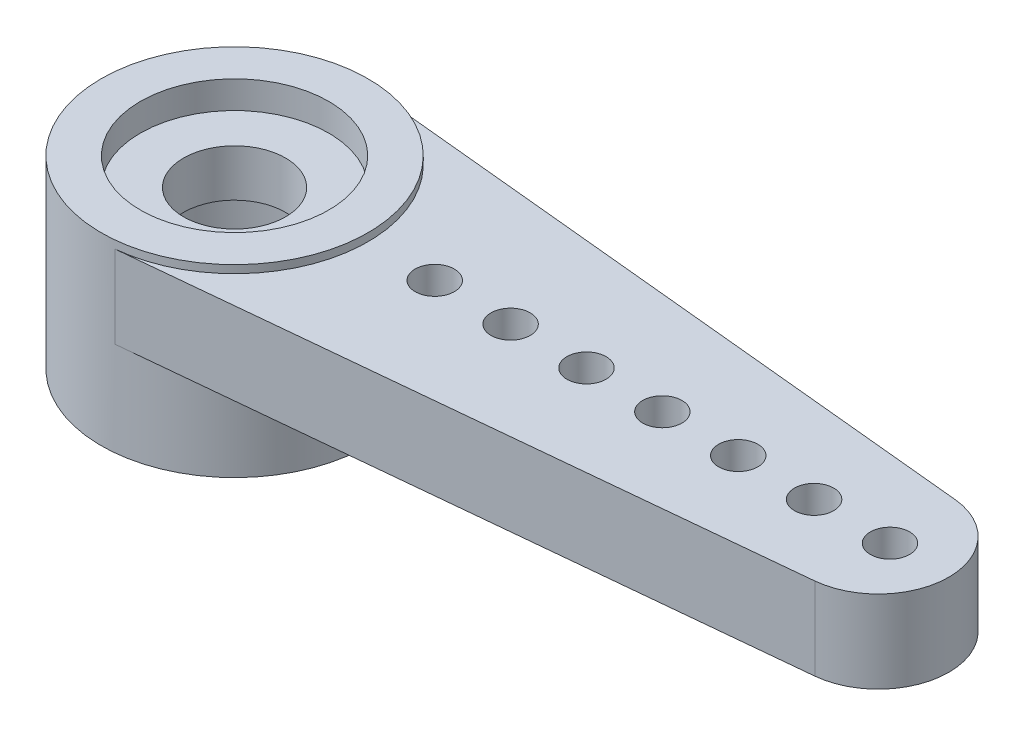
ISO-10303-21;
HEADER;
FILE_DESCRIPTION(('STEP AP214'),'2;1');
FILE_NAME('part.step','',(''),(''),'','','');
FILE_SCHEMA(('AUTOMOTIVE_DESIGN { 1 0 10303 214 1 1 1 1 }'));
ENDSEC;
DATA;
#1=APPLICATION_CONTEXT('core data for automotive mechanical design processes');
#2=APPLICATION_PROTOCOL_DEFINITION('international standard','automotive_design',2000,#1);
#3=PRODUCT_CONTEXT('',#1,'mechanical');
#4=PRODUCT('Part','Part','',(#3));
#5=PRODUCT_RELATED_PRODUCT_CATEGORY('part','',(#4));
#6=PRODUCT_DEFINITION_FORMATION('','',#4);
#7=PRODUCT_DEFINITION_CONTEXT('part definition',#1,'design');
#8=PRODUCT_DEFINITION('design','',#6,#7);
#9=PRODUCT_DEFINITION_SHAPE('','',#8);
#10=(LENGTH_UNIT() NAMED_UNIT(*) SI_UNIT(.MILLI.,.METRE.));
#11=(NAMED_UNIT(*) PLANE_ANGLE_UNIT() SI_UNIT($,.RADIAN.));
#12=(NAMED_UNIT(*) SI_UNIT($,.STERADIAN.) SOLID_ANGLE_UNIT());
#13=UNCERTAINTY_MEASURE_WITH_UNIT(LENGTH_MEASURE(1.E-05),#10,'distance_accuracy_value','');
#14=(GEOMETRIC_REPRESENTATION_CONTEXT(3) GLOBAL_UNCERTAINTY_ASSIGNED_CONTEXT((#13)) GLOBAL_UNIT_ASSIGNED_CONTEXT((#10,
#11,#12)) REPRESENTATION_CONTEXT('',''));
#15=CARTESIAN_POINT('',(0.,0.,0.));
#16=DIRECTION('',(0.,0.,1.));
#17=DIRECTION('',(1.,0.,0.));
#18=AXIS2_PLACEMENT_3D('',#15,#16,#17);
#19=CARTESIAN_POINT('',(30.,0.,0.));
#20=DIRECTION('',(0.,-1.,0.));
#21=DIRECTION('',(0.,0.,-1.));
#22=AXIS2_PLACEMENT_3D('',#19,#20,#21);
#23=PLANE('',#22);
#24=CARTESIAN_POINT('',(30.,0.,0.));
#25=DIRECTION('',(0.,1.,0.));
#26=DIRECTION('',(1.,0.,0.));
#27=AXIS2_PLACEMENT_3D('',#24,#25,#26);
#28=CIRCLE('',#27,2.4);
#29=CARTESIAN_POINT('',(27.6,0.,0.));
#30=VERTEX_POINT('',#29);
#31=EDGE_CURVE('E157',#30,#30,#28,.T.);
#32=ORIENTED_EDGE('',*,*,#31,.F.);
#33=EDGE_LOOP('',(#32));
#34=FACE_BOUND('',#33,.T.);
#35=CARTESIAN_POINT('',(30.,0.,0.));
#36=DIRECTION('',(0.,-1.,0.));
#37=DIRECTION('',(1.,0.,0.));
#38=AXIS2_PLACEMENT_3D('',#35,#36,#37);
#39=CIRCLE('',#38,3.4);
#40=CARTESIAN_POINT('',(26.6,0.,0.));
#41=VERTEX_POINT('',#40);
#42=EDGE_CURVE('E11',#41,#41,#39,.T.);
#43=ORIENTED_EDGE('',*,*,#42,.F.);
#44=EDGE_LOOP('',(#43));
#45=FACE_BOUND('',#44,.T.);
#46=ADVANCED_FACE('F17',(#34,#45),#23,.F.);
#47=CARTESIAN_POINT('',(30.,-4.7,0.));
#48=DIRECTION('',(0.,-1.,0.));
#49=DIRECTION('',(0.,0.,-1.));
#50=AXIS2_PLACEMENT_3D('',#47,#48,#49);
#51=PLANE('',#50);
#52=CARTESIAN_POINT('',(30.,-4.7,0.));
#53=DIRECTION('',(0.,1.,0.));
#54=DIRECTION('',(1.,0.,0.));
#55=AXIS2_PLACEMENT_3D('',#52,#53,#54);
#56=CIRCLE('',#55,2.4);
#57=CARTESIAN_POINT('',(27.6,-4.7,0.));
#58=VERTEX_POINT('',#57);
#59=EDGE_CURVE('E283',#58,#58,#56,.T.);
#60=ORIENTED_EDGE('',*,*,#59,.T.);
#61=EDGE_LOOP('',(#60));
#62=FACE_BOUND('',#61,.T.);
#63=CARTESIAN_POINT('',(30.,-4.7,0.));
#64=DIRECTION('',(0.,-1.,0.));
#65=DIRECTION('',(1.,0.,0.));
#66=AXIS2_PLACEMENT_3D('',#63,#64,#65);
#67=CIRCLE('',#66,3.4);
#68=CARTESIAN_POINT('',(26.6,-4.7,0.));
#69=VERTEX_POINT('',#68);
#70=EDGE_CURVE('E175',#69,#69,#67,.T.);
#71=ORIENTED_EDGE('',*,*,#70,.T.);
#72=EDGE_LOOP('',(#71));
#73=FACE_BOUND('',#72,.T.);
#74=ADVANCED_FACE('F296',(#62,#73),#51,.T.);
#75=CARTESIAN_POINT('',(30.,0.,0.));
#76=DIRECTION('',(0.,-1.,0.));
#77=DIRECTION('',(1.,0.,0.));
#78=AXIS2_PLACEMENT_3D('',#75,#76,#77);
#79=CYLINDRICAL_SURFACE('',#78,3.4);
#80=DIRECTION('',(0.,-1.,0.));
#81=VECTOR('',#80,1.);
#82=CARTESIAN_POINT('',(30.3317073170732,0.,-3.38378046802721));
#83=LINE('',#82,#81);
#84=CARTESIAN_POINT('',(30.3317073170732,-0.2,-3.38378046802721));
#85=VERTEX_POINT('',#84);
#86=CARTESIAN_POINT('',(30.3317073170732,-2.3,-3.38378046802721));
#87=VERTEX_POINT('',#86);
#88=EDGE_CURVE('E268',#85,#87,#83,.T.);
#89=ORIENTED_EDGE('',*,*,#88,.T.);
#90=CARTESIAN_POINT('',(30.,-2.3,0.));
#91=DIRECTION('',(0.,-1.,0.));
#92=DIRECTION('',(1.,0.,0.));
#93=AXIS2_PLACEMENT_3D('',#90,#91,#92);
#94=CIRCLE('',#93,3.4);
#95=CARTESIAN_POINT('',(30.3317073170732,-2.3,3.38378046802687));
#96=VERTEX_POINT('',#95);
#97=EDGE_CURVE('E264',#87,#96,#94,.T.);
#98=ORIENTED_EDGE('',*,*,#97,.T.);
#99=DIRECTION('',(0.,-1.,0.));
#100=VECTOR('',#99,1.);
#101=CARTESIAN_POINT('',(30.3317073170732,0.,3.38378046802687));
#102=LINE('',#101,#100);
#103=CARTESIAN_POINT('',(30.3317073170732,-0.2,3.38378046802687));
#104=VERTEX_POINT('',#103);
#105=EDGE_CURVE('E245',#104,#96,#102,.T.);
#106=ORIENTED_EDGE('',*,*,#105,.F.);
#107=CARTESIAN_POINT('',(30.,-0.2,0.));
#108=DIRECTION('',(0.,1.,0.));
#109=DIRECTION('',(1.,0.,0.));
#110=AXIS2_PLACEMENT_3D('',#107,#108,#109);
#111=CIRCLE('',#110,3.4);
#112=EDGE_CURVE('E267',#104,#85,#111,.T.);
#113=ORIENTED_EDGE('',*,*,#112,.T.);
#114=EDGE_LOOP('',(#89,#98,#106,#113));
#115=FACE_BOUND('',#114,.T.);
#116=ORIENTED_EDGE('',*,*,#70,.F.);
#117=DIRECTION('',(0.,1.,0.));
#118=VECTOR('',#117,1.);
#119=CARTESIAN_POINT('',(26.6,0.,0.));
#120=LINE('',#119,#118);
#121=EDGE_CURVE('E20',#69,#41,#120,.T.);
#122=ORIENTED_EDGE('',*,*,#121,.T.);
#123=ORIENTED_EDGE('',*,*,#42,.T.);
#124=ORIENTED_EDGE('',*,*,#121,.F.);
#125=EDGE_LOOP('',(#116,#122,#123,#124));
#126=FACE_BOUND('',#125,.T.);
#127=ADVANCED_FACE('F299',(#115,#126),#79,.T.);
#128=CARTESIAN_POINT('',(30.,0.,0.));
#129=DIRECTION('',(0.,-1.,0.));
#130=DIRECTION('',(1.,0.,0.));
#131=AXIS2_PLACEMENT_3D('',#128,#129,#130);
#132=CYLINDRICAL_SURFACE('',#131,2.4);
#133=ORIENTED_EDGE('',*,*,#59,.F.);
#134=DIRECTION('',(0.,1.,0.));
#135=VECTOR('',#134,1.);
#136=CARTESIAN_POINT('',(27.6,0.,0.));
#137=LINE('',#136,#135);
#138=CARTESIAN_POINT('',(27.6,-1.9,0.));
#139=VERTEX_POINT('',#138);
#140=EDGE_CURVE('E178',#58,#139,#137,.T.);
#141=ORIENTED_EDGE('',*,*,#140,.T.);
#142=CARTESIAN_POINT('',(30.,-1.9,0.));
#143=DIRECTION('',(0.,1.,0.));
#144=DIRECTION('',(1.,0.,0.));
#145=AXIS2_PLACEMENT_3D('',#142,#143,#144);
#146=CIRCLE('',#145,2.4);
#147=EDGE_CURVE('E294',#139,#139,#146,.T.);
#148=ORIENTED_EDGE('',*,*,#147,.T.);
#149=ORIENTED_EDGE('',*,*,#140,.F.);
#150=EDGE_LOOP('',(#133,#141,#148,#149));
#151=FACE_BOUND('',#150,.T.);
#152=ADVANCED_FACE('F292',(#151),#132,.F.);
#153=CARTESIAN_POINT('',(39.2658536585367,-0.2,-1.73194791841524E-13));
#154=DIRECTION('',(0.,-1.,0.));
#155=DIRECTION('',(0.,0.,-1.));
#156=AXIS2_PLACEMENT_3D('',#153,#154,#155);
#157=PLANE('',#156);
#158=CARTESIAN_POINT('',(35.1,-0.2,0.));
#159=DIRECTION('',(0.,1.,0.));
#160=DIRECTION('',(1.,0.,0.));
#161=AXIS2_PLACEMENT_3D('',#158,#159,#160);
#162=CIRCLE('',#161,0.5);
#163=CARTESIAN_POINT('',(34.6,-0.2,0.));
#164=VERTEX_POINT('',#163);
#165=EDGE_CURVE('E182',#164,#164,#162,.T.);
#166=ORIENTED_EDGE('',*,*,#165,.F.);
#167=EDGE_LOOP('',(#166));
#168=FACE_BOUND('',#167,.T.);
#169=CARTESIAN_POINT('',(44.7666666666667,-0.2,0.));
#170=DIRECTION('',(0.,1.,0.));
#171=DIRECTION('',(1.,0.,0.));
#172=AXIS2_PLACEMENT_3D('',#169,#170,#171);
#173=CIRCLE('',#172,0.5);
#174=CARTESIAN_POINT('',(44.2666666666667,-0.2,0.));
#175=VERTEX_POINT('',#174);
#176=EDGE_CURVE('E192',#175,#175,#173,.T.);
#177=ORIENTED_EDGE('',*,*,#176,.F.);
#178=EDGE_LOOP('',(#177));
#179=FACE_BOUND('',#178,.T.);
#180=CARTESIAN_POINT('',(38.9666666666667,-0.2,0.));
#181=DIRECTION('',(0.,1.,0.));
#182=DIRECTION('',(1.,0.,0.));
#183=AXIS2_PLACEMENT_3D('',#180,#181,#182);
#184=CIRCLE('',#183,0.5);
#185=CARTESIAN_POINT('',(38.4666666666667,-0.2,0.));
#186=VERTEX_POINT('',#185);
#187=EDGE_CURVE('E183',#186,#186,#184,.T.);
#188=ORIENTED_EDGE('',*,*,#187,.F.);
#189=EDGE_LOOP('',(#188));
#190=FACE_BOUND('',#189,.T.);
#191=CARTESIAN_POINT('',(46.7,-0.2,0.));
#192=DIRECTION('',(0.,1.,0.));
#193=DIRECTION('',(1.,0.,0.));
#194=AXIS2_PLACEMENT_3D('',#191,#192,#193);
#195=CIRCLE('',#194,0.5);
#196=CARTESIAN_POINT('',(46.2,-0.2,0.));
#197=VERTEX_POINT('',#196);
#198=EDGE_CURVE('E205',#197,#197,#195,.T.);
#199=ORIENTED_EDGE('',*,*,#198,.F.);
#200=EDGE_LOOP('',(#199));
#201=FACE_BOUND('',#200,.T.);
#202=CARTESIAN_POINT('',(37.0333333333333,-0.2,0.));
#203=DIRECTION('',(0.,1.,0.));
#204=DIRECTION('',(1.,0.,0.));
#205=AXIS2_PLACEMENT_3D('',#202,#203,#204);
#206=CIRCLE('',#205,0.5);
#207=CARTESIAN_POINT('',(36.5333333333333,-0.2,0.));
#208=VERTEX_POINT('',#207);
#209=EDGE_CURVE('E227',#208,#208,#206,.T.);
#210=ORIENTED_EDGE('',*,*,#209,.F.);
#211=EDGE_LOOP('',(#210));
#212=FACE_BOUND('',#211,.T.);
#213=CARTESIAN_POINT('',(42.8333333333333,-0.2,0.));
#214=DIRECTION('',(0.,1.,0.));
#215=DIRECTION('',(1.,0.,0.));
#216=AXIS2_PLACEMENT_3D('',#213,#214,#215);
#217=CIRCLE('',#216,0.5);
#218=CARTESIAN_POINT('',(42.3333333333333,-0.2,0.));
#219=VERTEX_POINT('',#218);
#220=EDGE_CURVE('E211',#219,#219,#217,.T.);
#221=ORIENTED_EDGE('',*,*,#220,.F.);
#222=EDGE_LOOP('',(#221));
#223=FACE_BOUND('',#222,.T.);
#224=CARTESIAN_POINT('',(40.9,-0.2,0.));
#225=DIRECTION('',(0.,1.,0.));
#226=DIRECTION('',(1.,0.,0.));
#227=AXIS2_PLACEMENT_3D('',#224,#225,#226);
#228=CIRCLE('',#227,0.5);
#229=CARTESIAN_POINT('',(40.4,-0.2,0.));
#230=VERTEX_POINT('',#229);
#231=EDGE_CURVE('E238',#230,#230,#228,.T.);
#232=ORIENTED_EDGE('',*,*,#231,.F.);
#233=EDGE_LOOP('',(#232));
#234=FACE_BOUND('',#233,.T.);
#235=DIRECTION('',(0.995229549419666,0.,0.0975609756097661));
#236=VECTOR('',#235,1.);
#237=CARTESIAN_POINT('',(30.3317073170732,-0.2,-3.38378046802721));
#238=LINE('',#237,#236);
#239=CARTESIAN_POINT('',(46.5756097560976,-0.2,-1.79141318895558));
#240=VERTEX_POINT('',#239);
#241=EDGE_CURVE('E272',#85,#240,#238,.T.);
#242=ORIENTED_EDGE('',*,*,#241,.F.);
#243=ORIENTED_EDGE('',*,*,#112,.F.);
#244=DIRECTION('',(-0.995229549419667,0.,0.0975609756097562));
#245=VECTOR('',#244,1.);
#246=CARTESIAN_POINT('',(46.5756097560976,-0.2,1.7914131889554));
#247=LINE('',#246,#245);
#248=CARTESIAN_POINT('',(46.5756097560976,-0.2,1.79141318895558));
#249=VERTEX_POINT('',#248);
#250=EDGE_CURVE('E241',#249,#104,#247,.T.);
#251=ORIENTED_EDGE('',*,*,#250,.F.);
#252=CARTESIAN_POINT('',(46.4,-0.2,0.));
#253=DIRECTION('',(0.,-1.,0.));
#254=DIRECTION('',(0.0975609756097438,0.,-0.995229549419668));
#255=AXIS2_PLACEMENT_3D('',#252,#253,#254);
#256=CIRCLE('',#255,1.80000000000018);
#257=EDGE_CURVE('E257',#240,#249,#256,.T.);
#258=ORIENTED_EDGE('',*,*,#257,.F.);
#259=EDGE_LOOP('',(#242,#243,#251,#258));
#260=FACE_BOUND('',#259,.T.);
#261=ADVANCED_FACE('F417',(#168,#179,#190,#201,#212,#223,#234,#260),#157,.F.);
#262=CARTESIAN_POINT('',(39.2658536585367,-2.3,-1.73194791841524E-13));
#263=DIRECTION('',(0.,-1.,0.));
#264=DIRECTION('',(0.,0.,-1.));
#265=AXIS2_PLACEMENT_3D('',#262,#263,#264);
#266=PLANE('',#265);
#267=CARTESIAN_POINT('',(35.1,-2.3,0.));
#268=DIRECTION('',(0.,1.,0.));
#269=DIRECTION('',(1.,0.,0.));
#270=AXIS2_PLACEMENT_3D('',#267,#268,#269);
#271=CIRCLE('',#270,0.5);
#272=CARTESIAN_POINT('',(34.6,-2.3,0.));
#273=VERTEX_POINT('',#272);
#274=EDGE_CURVE('E163',#273,#273,#271,.T.);
#275=ORIENTED_EDGE('',*,*,#274,.T.);
#276=EDGE_LOOP('',(#275));
#277=FACE_BOUND('',#276,.T.);
#278=CARTESIAN_POINT('',(44.7666666666667,-2.3,0.));
#279=DIRECTION('',(0.,1.,0.));
#280=DIRECTION('',(1.,0.,0.));
#281=AXIS2_PLACEMENT_3D('',#278,#279,#280);
#282=CIRCLE('',#281,0.5);
#283=CARTESIAN_POINT('',(44.2666666666667,-2.3,0.));
#284=VERTEX_POINT('',#283);
#285=EDGE_CURVE('E193',#284,#284,#282,.T.);
#286=ORIENTED_EDGE('',*,*,#285,.T.);
#287=EDGE_LOOP('',(#286));
#288=FACE_BOUND('',#287,.T.);
#289=CARTESIAN_POINT('',(38.9666666666667,-2.3,0.));
#290=DIRECTION('',(0.,1.,0.));
#291=DIRECTION('',(1.,0.,0.));
#292=AXIS2_PLACEMENT_3D('',#289,#290,#291);
#293=CIRCLE('',#292,0.5);
#294=CARTESIAN_POINT('',(38.4666666666667,-2.3,0.));
#295=VERTEX_POINT('',#294);
#296=EDGE_CURVE('E194',#295,#295,#293,.T.);
#297=ORIENTED_EDGE('',*,*,#296,.T.);
#298=EDGE_LOOP('',(#297));
#299=FACE_BOUND('',#298,.T.);
#300=CARTESIAN_POINT('',(46.7,-2.3,0.));
#301=DIRECTION('',(0.,1.,0.));
#302=DIRECTION('',(1.,0.,0.));
#303=AXIS2_PLACEMENT_3D('',#300,#301,#302);
#304=CIRCLE('',#303,0.5);
#305=CARTESIAN_POINT('',(46.2,-2.3,0.));
#306=VERTEX_POINT('',#305);
#307=EDGE_CURVE('E186',#306,#306,#304,.T.);
#308=ORIENTED_EDGE('',*,*,#307,.T.);
#309=EDGE_LOOP('',(#308));
#310=FACE_BOUND('',#309,.T.);
#311=CARTESIAN_POINT('',(37.0333333333333,-2.3,0.));
#312=DIRECTION('',(0.,1.,0.));
#313=DIRECTION('',(1.,0.,0.));
#314=AXIS2_PLACEMENT_3D('',#311,#312,#313);
#315=CIRCLE('',#314,0.5);
#316=CARTESIAN_POINT('',(36.5333333333333,-2.3,0.));
#317=VERTEX_POINT('',#316);
#318=EDGE_CURVE('E214',#317,#317,#315,.T.);
#319=ORIENTED_EDGE('',*,*,#318,.T.);
#320=EDGE_LOOP('',(#319));
#321=FACE_BOUND('',#320,.T.);
#322=CARTESIAN_POINT('',(42.8333333333333,-2.3,0.));
#323=DIRECTION('',(0.,1.,0.));
#324=DIRECTION('',(1.,0.,0.));
#325=AXIS2_PLACEMENT_3D('',#322,#323,#324);
#326=CIRCLE('',#325,0.5);
#327=CARTESIAN_POINT('',(42.3333333333333,-2.3,0.));
#328=VERTEX_POINT('',#327);
#329=EDGE_CURVE('E223',#328,#328,#326,.T.);
#330=ORIENTED_EDGE('',*,*,#329,.T.);
#331=EDGE_LOOP('',(#330));
#332=FACE_BOUND('',#331,.T.);
#333=CARTESIAN_POINT('',(40.9,-2.3,0.));
#334=DIRECTION('',(0.,1.,0.));
#335=DIRECTION('',(1.,0.,0.));
#336=AXIS2_PLACEMENT_3D('',#333,#334,#335);
#337=CIRCLE('',#336,0.5);
#338=CARTESIAN_POINT('',(40.4,-2.3,0.));
#339=VERTEX_POINT('',#338);
#340=EDGE_CURVE('E206',#339,#339,#337,.T.);
#341=ORIENTED_EDGE('',*,*,#340,.T.);
#342=EDGE_LOOP('',(#341));
#343=FACE_BOUND('',#342,.T.);
#344=DIRECTION('',(0.995229549419666,0.,0.0975609756097661));
#345=VECTOR('',#344,1.);
#346=CARTESIAN_POINT('',(30.3317073170732,-2.3,-3.38378046802721));
#347=LINE('',#346,#345);
#348=CARTESIAN_POINT('',(46.5756097560976,-2.3,-1.79141318895558));
#349=VERTEX_POINT('',#348);
#350=EDGE_CURVE('E275',#87,#349,#347,.T.);
#351=ORIENTED_EDGE('',*,*,#350,.T.);
#352=CARTESIAN_POINT('',(46.4,-2.3,0.));
#353=DIRECTION('',(0.,-1.,0.));
#354=DIRECTION('',(0.0975609756097438,0.,-0.995229549419668));
#355=AXIS2_PLACEMENT_3D('',#352,#353,#354);
#356=CIRCLE('',#355,1.80000000000018);
#357=CARTESIAN_POINT('',(46.5756097560976,-2.3,1.79141318895558));
#358=VERTEX_POINT('',#357);
#359=EDGE_CURVE('E260',#349,#358,#356,.T.);
#360=ORIENTED_EDGE('',*,*,#359,.T.);
#361=DIRECTION('',(-0.995229549419667,0.,0.0975609756097562));
#362=VECTOR('',#361,1.);
#363=CARTESIAN_POINT('',(46.5756097560976,-2.3,1.7914131889554));
#364=LINE('',#363,#362);
#365=EDGE_CURVE('E249',#358,#96,#364,.T.);
#366=ORIENTED_EDGE('',*,*,#365,.T.);
#367=ORIENTED_EDGE('',*,*,#97,.F.);
#368=EDGE_LOOP('',(#351,#360,#366,#367));
#369=FACE_BOUND('',#368,.T.);
#370=ADVANCED_FACE('F322',(#277,#288,#299,#310,#321,#332,#343,#369),#266,.T.);
#371=CARTESIAN_POINT('',(30.3317073170732,-0.2,-3.38378046802721));
#372=DIRECTION('',(0.0975609756097661,0.,-0.995229549419666));
#373=DIRECTION('',(0.,-1.,0.));
#374=AXIS2_PLACEMENT_3D('',#371,#372,#373);
#375=PLANE('',#374);
#376=ORIENTED_EDGE('',*,*,#241,.T.);
#377=DIRECTION('',(0.,-1.,0.));
#378=VECTOR('',#377,1.);
#379=CARTESIAN_POINT('',(46.5756097560976,-0.2,-1.79141318895558));
#380=LINE('',#379,#378);
#381=EDGE_CURVE('E263',#240,#349,#380,.T.);
#382=ORIENTED_EDGE('',*,*,#381,.T.);
#383=ORIENTED_EDGE('',*,*,#350,.F.);
#384=ORIENTED_EDGE('',*,*,#88,.F.);
#385=EDGE_LOOP('',(#376,#382,#383,#384));
#386=FACE_BOUND('',#385,.T.);
#387=ADVANCED_FACE('F316',(#386),#375,.T.);
#388=CARTESIAN_POINT('',(46.4,-0.2,0.));
#389=DIRECTION('',(0.,-1.,0.));
#390=DIRECTION('',(0.0975609756097438,0.,-0.995229549419668));
#391=AXIS2_PLACEMENT_3D('',#388,#389,#390);
#392=CYLINDRICAL_SURFACE('',#391,1.80000000000018);
#393=ORIENTED_EDGE('',*,*,#257,.T.);
#394=DIRECTION('',(0.,-1.,0.));
#395=VECTOR('',#394,1.);
#396=CARTESIAN_POINT('',(46.5756097560976,-0.2,1.79141318895558));
#397=LINE('',#396,#395);
#398=EDGE_CURVE('E253',#249,#358,#397,.T.);
#399=ORIENTED_EDGE('',*,*,#398,.T.);
#400=ORIENTED_EDGE('',*,*,#359,.F.);
#401=ORIENTED_EDGE('',*,*,#381,.F.);
#402=EDGE_LOOP('',(#393,#399,#400,#401));
#403=FACE_BOUND('',#402,.T.);
#404=ADVANCED_FACE('F321',(#403),#392,.T.);
#405=CARTESIAN_POINT('',(46.5756097560976,-0.2,1.7914131889554));
#406=DIRECTION('',(0.0975609756097562,0.,0.995229549419667));
#407=DIRECTION('',(0.,-1.,0.));
#408=AXIS2_PLACEMENT_3D('',#405,#406,#407);
#409=PLANE('',#408);
#410=ORIENTED_EDGE('',*,*,#250,.T.);
#411=ORIENTED_EDGE('',*,*,#105,.T.);
#412=ORIENTED_EDGE('',*,*,#365,.F.);
#413=ORIENTED_EDGE('',*,*,#398,.F.);
#414=EDGE_LOOP('',(#410,#411,#412,#413));
#415=FACE_BOUND('',#414,.T.);
#416=ADVANCED_FACE('F411',(#415),#409,.T.);
#417=CARTESIAN_POINT('',(40.9,-0.2,0.));
#418=DIRECTION('',(0.,-1.,0.));
#419=DIRECTION('',(1.,0.,0.));
#420=AXIS2_PLACEMENT_3D('',#417,#418,#419);
#421=CYLINDRICAL_SURFACE('',#420,0.5);
#422=ORIENTED_EDGE('',*,*,#340,.F.);
#423=DIRECTION('',(0.,1.,0.));
#424=VECTOR('',#423,1.);
#425=CARTESIAN_POINT('',(40.4,-0.2,0.));
#426=LINE('',#425,#424);
#427=EDGE_CURVE('E210',#339,#230,#426,.T.);
#428=ORIENTED_EDGE('',*,*,#427,.T.);
#429=ORIENTED_EDGE('',*,*,#231,.T.);
#430=ORIENTED_EDGE('',*,*,#427,.F.);
#431=EDGE_LOOP('',(#422,#428,#429,#430));
#432=FACE_BOUND('',#431,.T.);
#433=ADVANCED_FACE('F402',(#432),#421,.F.);
#434=CARTESIAN_POINT('',(42.8333333333333,-0.2,0.));
#435=DIRECTION('',(0.,-1.,0.));
#436=DIRECTION('',(1.,0.,0.));
#437=AXIS2_PLACEMENT_3D('',#434,#435,#436);
#438=CYLINDRICAL_SURFACE('',#437,0.5);
#439=ORIENTED_EDGE('',*,*,#329,.F.);
#440=DIRECTION('',(0.,1.,0.));
#441=VECTOR('',#440,1.);
#442=CARTESIAN_POINT('',(42.3333333333333,-0.2,0.));
#443=LINE('',#442,#441);
#444=EDGE_CURVE('E219',#328,#219,#443,.T.);
#445=ORIENTED_EDGE('',*,*,#444,.T.);
#446=ORIENTED_EDGE('',*,*,#220,.T.);
#447=ORIENTED_EDGE('',*,*,#444,.F.);
#448=EDGE_LOOP('',(#439,#445,#446,#447));
#449=FACE_BOUND('',#448,.T.);
#450=ADVANCED_FACE('F393',(#449),#438,.F.);
#451=CARTESIAN_POINT('',(37.0333333333333,-0.2,0.));
#452=DIRECTION('',(0.,-1.,0.));
#453=DIRECTION('',(1.,0.,0.));
#454=AXIS2_PLACEMENT_3D('',#451,#452,#453);
#455=CYLINDRICAL_SURFACE('',#454,0.5);
#456=ORIENTED_EDGE('',*,*,#318,.F.);
#457=DIRECTION('',(0.,1.,0.));
#458=VECTOR('',#457,1.);
#459=CARTESIAN_POINT('',(36.5333333333333,-0.2,0.));
#460=LINE('',#459,#458);
#461=EDGE_CURVE('E218',#317,#208,#460,.T.);
#462=ORIENTED_EDGE('',*,*,#461,.T.);
#463=ORIENTED_EDGE('',*,*,#209,.T.);
#464=ORIENTED_EDGE('',*,*,#461,.F.);
#465=EDGE_LOOP('',(#456,#462,#463,#464));
#466=FACE_BOUND('',#465,.T.);
#467=ADVANCED_FACE('F384',(#466),#455,.F.);
#468=CARTESIAN_POINT('',(46.7,-0.2,0.));
#469=DIRECTION('',(0.,-1.,0.));
#470=DIRECTION('',(1.,0.,0.));
#471=AXIS2_PLACEMENT_3D('',#468,#469,#470);
#472=CYLINDRICAL_SURFACE('',#471,0.5);
#473=ORIENTED_EDGE('',*,*,#307,.F.);
#474=DIRECTION('',(0.,1.,0.));
#475=VECTOR('',#474,1.);
#476=CARTESIAN_POINT('',(46.2,-0.2,0.));
#477=LINE('',#476,#475);
#478=EDGE_CURVE('E201',#306,#197,#477,.T.);
#479=ORIENTED_EDGE('',*,*,#478,.T.);
#480=ORIENTED_EDGE('',*,*,#198,.T.);
#481=ORIENTED_EDGE('',*,*,#478,.F.);
#482=EDGE_LOOP('',(#473,#479,#480,#481));
#483=FACE_BOUND('',#482,.T.);
#484=ADVANCED_FACE('F375',(#483),#472,.F.);
#485=CARTESIAN_POINT('',(38.9666666666667,-0.2,0.));
#486=DIRECTION('',(0.,-1.,0.));
#487=DIRECTION('',(1.,0.,0.));
#488=AXIS2_PLACEMENT_3D('',#485,#486,#487);
#489=CYLINDRICAL_SURFACE('',#488,0.5);
#490=ORIENTED_EDGE('',*,*,#296,.F.);
#491=DIRECTION('',(0.,1.,0.));
#492=VECTOR('',#491,1.);
#493=CARTESIAN_POINT('',(38.4666666666667,-0.2,0.));
#494=LINE('',#493,#492);
#495=EDGE_CURVE('E187',#295,#186,#494,.T.);
#496=ORIENTED_EDGE('',*,*,#495,.T.);
#497=ORIENTED_EDGE('',*,*,#187,.T.);
#498=ORIENTED_EDGE('',*,*,#495,.F.);
#499=EDGE_LOOP('',(#490,#496,#497,#498));
#500=FACE_BOUND('',#499,.T.);
#501=ADVANCED_FACE('F359',(#500),#489,.F.);
#502=CARTESIAN_POINT('',(44.7666666666667,-0.2,0.));
#503=DIRECTION('',(0.,-1.,0.));
#504=DIRECTION('',(1.,0.,0.));
#505=AXIS2_PLACEMENT_3D('',#502,#503,#504);
#506=CYLINDRICAL_SURFACE('',#505,0.5);
#507=ORIENTED_EDGE('',*,*,#285,.F.);
#508=DIRECTION('',(0.,1.,0.));
#509=VECTOR('',#508,1.);
#510=CARTESIAN_POINT('',(44.2666666666667,-0.2,0.));
#511=LINE('',#510,#509);
#512=EDGE_CURVE('E188',#284,#175,#511,.T.);
#513=ORIENTED_EDGE('',*,*,#512,.T.);
#514=ORIENTED_EDGE('',*,*,#176,.T.);
#515=ORIENTED_EDGE('',*,*,#512,.F.);
#516=EDGE_LOOP('',(#507,#513,#514,#515));
#517=FACE_BOUND('',#516,.T.);
#518=ADVANCED_FACE('F354',(#517),#506,.F.);
#519=CARTESIAN_POINT('',(35.1,-0.2,0.));
#520=DIRECTION('',(0.,-1.,0.));
#521=DIRECTION('',(1.,0.,0.));
#522=AXIS2_PLACEMENT_3D('',#519,#520,#521);
#523=CYLINDRICAL_SURFACE('',#522,0.5);
#524=ORIENTED_EDGE('',*,*,#274,.F.);
#525=DIRECTION('',(0.,1.,0.));
#526=VECTOR('',#525,1.);
#527=CARTESIAN_POINT('',(34.6,-0.2,0.));
#528=LINE('',#527,#526);
#529=EDGE_CURVE('E169',#273,#164,#528,.T.);
#530=ORIENTED_EDGE('',*,*,#529,.T.);
#531=ORIENTED_EDGE('',*,*,#165,.T.);
#532=ORIENTED_EDGE('',*,*,#529,.F.);
#533=EDGE_LOOP('',(#524,#530,#531,#532));
#534=FACE_BOUND('',#533,.T.);
#535=ADVANCED_FACE('F349',(#534),#523,.F.);
#536=CARTESIAN_POINT('',(30.,0.,0.));
#537=DIRECTION('',(0.,-1.,0.));
#538=DIRECTION('',(1.,0.,0.));
#539=AXIS2_PLACEMENT_3D('',#536,#537,#538);
#540=CYLINDRICAL_SURFACE('',#539,2.4);
#541=CARTESIAN_POINT('',(30.,-0.7,0.));
#542=DIRECTION('',(0.,-1.,0.));
#543=DIRECTION('',(1.,0.,0.));
#544=AXIS2_PLACEMENT_3D('',#541,#542,#543);
#545=CIRCLE('',#544,2.4);
#546=CARTESIAN_POINT('',(27.6,-0.7,0.));
#547=VERTEX_POINT('',#546);
#548=EDGE_CURVE('E171',#547,#547,#545,.T.);
#549=ORIENTED_EDGE('',*,*,#548,.T.);
#550=DIRECTION('',(0.,1.,0.));
#551=VECTOR('',#550,1.);
#552=CARTESIAN_POINT('',(27.6,0.,0.));
#553=LINE('',#552,#551);
#554=EDGE_CURVE('E160',#547,#30,#553,.T.);
#555=ORIENTED_EDGE('',*,*,#554,.T.);
#556=ORIENTED_EDGE('',*,*,#31,.T.);
#557=ORIENTED_EDGE('',*,*,#554,.F.);
#558=EDGE_LOOP('',(#549,#555,#556,#557));
#559=FACE_BOUND('',#558,.T.);
#560=ADVANCED_FACE('F159',(#559),#540,.F.);
#561=CARTESIAN_POINT('',(30.,-0.7,0.));
#562=DIRECTION('',(0.,-1.,0.));
#563=DIRECTION('',(0.,0.,-1.));
#564=AXIS2_PLACEMENT_3D('',#561,#562,#563);
#565=PLANE('',#564);
#566=CARTESIAN_POINT('',(30.,-0.7,0.));
#567=DIRECTION('',(0.,1.,0.));
#568=DIRECTION('',(1.,0.,0.));
#569=AXIS2_PLACEMENT_3D('',#566,#567,#568);
#570=CIRCLE('',#569,1.3);
#571=CARTESIAN_POINT('',(28.7,-0.7,0.));
#572=VERTEX_POINT('',#571);
#573=EDGE_CURVE('E557',#572,#572,#570,.T.);
#574=ORIENTED_EDGE('',*,*,#573,.F.);
#575=EDGE_LOOP('',(#574));
#576=FACE_BOUND('',#575,.T.);
#577=ORIENTED_EDGE('',*,*,#548,.F.);
#578=EDGE_LOOP('',(#577));
#579=FACE_BOUND('',#578,.T.);
#580=ADVANCED_FACE('F329',(#576,#579),#565,.F.);
#581=CARTESIAN_POINT('',(30.,-1.9,0.));
#582=DIRECTION('',(0.,-1.,0.));
#583=DIRECTION('',(0.,0.,-1.));
#584=AXIS2_PLACEMENT_3D('',#581,#582,#583);
#585=PLANE('',#584);
#586=CARTESIAN_POINT('',(30.,-1.9,0.));
#587=DIRECTION('',(0.,1.,0.));
#588=DIRECTION('',(1.,0.,0.));
#589=AXIS2_PLACEMENT_3D('',#586,#587,#588);
#590=CIRCLE('',#589,1.3);
#591=CARTESIAN_POINT('',(28.7,-1.9,0.));
#592=VERTEX_POINT('',#591);
#593=EDGE_CURVE('E561',#592,#592,#590,.T.);
#594=ORIENTED_EDGE('',*,*,#593,.T.);
#595=EDGE_LOOP('',(#594));
#596=FACE_BOUND('',#595,.T.);
#597=ORIENTED_EDGE('',*,*,#147,.F.);
#598=EDGE_LOOP('',(#597));
#599=FACE_BOUND('',#598,.T.);
#600=ADVANCED_FACE('F309',(#596,#599),#585,.T.);
#601=CARTESIAN_POINT('',(30.,-0.7,0.));
#602=DIRECTION('',(0.,-1.,0.));
#603=DIRECTION('',(1.,0.,0.));
#604=AXIS2_PLACEMENT_3D('',#601,#602,#603);
#605=CYLINDRICAL_SURFACE('',#604,1.3);
#606=ORIENTED_EDGE('',*,*,#593,.F.);
#607=DIRECTION('',(0.,1.,0.));
#608=VECTOR('',#607,1.);
#609=CARTESIAN_POINT('',(28.7,-0.7,0.));
#610=LINE('',#609,#608);
#611=EDGE_CURVE('E555',#592,#572,#610,.T.);
#612=ORIENTED_EDGE('',*,*,#611,.T.);
#613=ORIENTED_EDGE('',*,*,#573,.T.);
#614=ORIENTED_EDGE('',*,*,#611,.F.);
#615=EDGE_LOOP('',(#606,#612,#613,#614));
#616=FACE_BOUND('',#615,.T.);
#617=ADVANCED_FACE('F304',(#616),#605,.F.);
#618=CLOSED_SHELL('',(#46,#74,#127,#152,#261,#370,#387,#404,#416,#433,#450,#467,#484,#501,#518,
#535,#560,#580,#600,#617));
#619=MANIFOLD_SOLID_BREP('B1',#618);
#620=ADVANCED_BREP_SHAPE_REPRESENTATION('',(#18,#619),#14);
#621=SHAPE_DEFINITION_REPRESENTATION(#9,#620);
ENDSEC;
END-ISO-10303-21;
